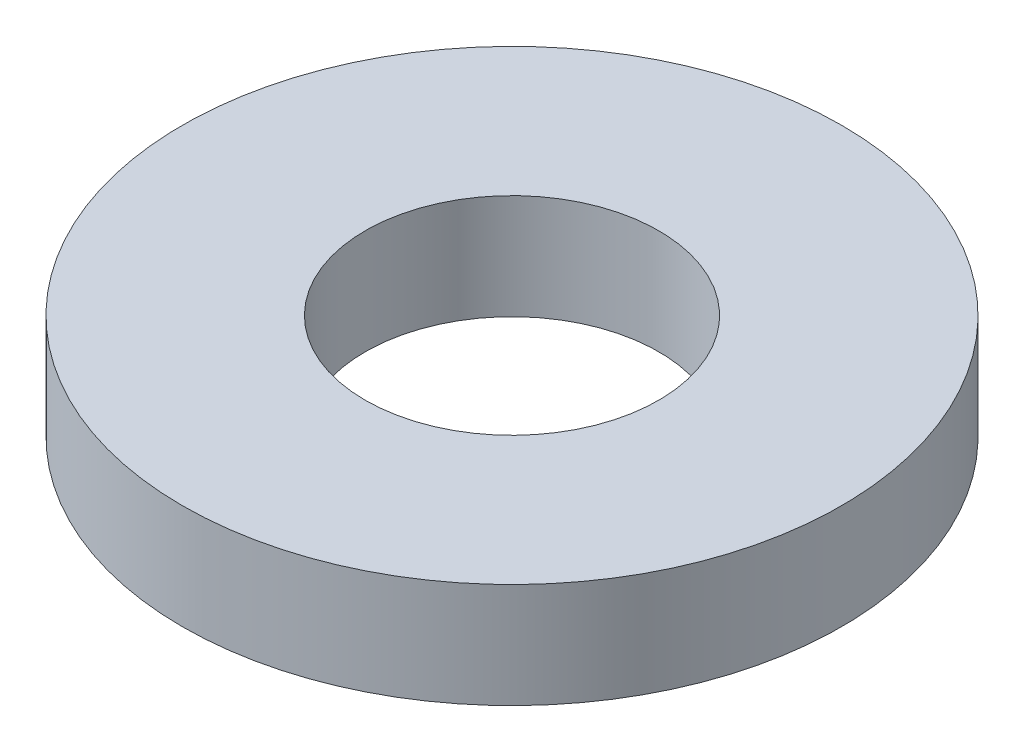
ISO-10303-21;
HEADER;
FILE_DESCRIPTION(('STEP AP214'),'2;1');
FILE_NAME('part.step','',(''),(''),'','','');
FILE_SCHEMA(('AUTOMOTIVE_DESIGN { 1 0 10303 214 1 1 1 1 }'));
ENDSEC;
DATA;
#1=APPLICATION_CONTEXT('core data for automotive mechanical design processes');
#2=APPLICATION_PROTOCOL_DEFINITION('international standard','automotive_design',2000,#1);
#3=PRODUCT_CONTEXT('',#1,'mechanical');
#4=PRODUCT('Part','Part','',(#3));
#5=PRODUCT_RELATED_PRODUCT_CATEGORY('part','',(#4));
#6=PRODUCT_DEFINITION_FORMATION('','',#4);
#7=PRODUCT_DEFINITION_CONTEXT('part definition',#1,'design');
#8=PRODUCT_DEFINITION('design','',#6,#7);
#9=PRODUCT_DEFINITION_SHAPE('','',#8);
#10=(LENGTH_UNIT() NAMED_UNIT(*) SI_UNIT(.MILLI.,.METRE.));
#11=(NAMED_UNIT(*) PLANE_ANGLE_UNIT() SI_UNIT($,.RADIAN.));
#12=(NAMED_UNIT(*) SI_UNIT($,.STERADIAN.) SOLID_ANGLE_UNIT());
#13=UNCERTAINTY_MEASURE_WITH_UNIT(LENGTH_MEASURE(1.E-05),#10,'distance_accuracy_value','');
#14=(GEOMETRIC_REPRESENTATION_CONTEXT(3) GLOBAL_UNCERTAINTY_ASSIGNED_CONTEXT((#13)) GLOBAL_UNIT_ASSIGNED_CONTEXT((#10,
#11,#12)) REPRESENTATION_CONTEXT('',''));
#15=CARTESIAN_POINT('',(0.,0.,0.));
#16=DIRECTION('',(0.,0.,1.));
#17=DIRECTION('',(1.,0.,0.));
#18=AXIS2_PLACEMENT_3D('',#15,#16,#17);
#19=CARTESIAN_POINT('',(0.,1.778,0.));
#20=DIRECTION('',(0.,1.,0.));
#21=DIRECTION('',(0.,0.,1.));
#22=AXIS2_PLACEMENT_3D('',#19,#20,#21);
#23=PLANE('',#22);
#24=CARTESIAN_POINT('',(0.,1.778,0.));
#25=DIRECTION('',(0.,1.,0.));
#26=DIRECTION('',(0.,0.,1.));
#27=AXIS2_PLACEMENT_3D('',#24,#25,#26);
#28=CIRCLE('',#27,5.588);
#29=CARTESIAN_POINT('',(0.,1.778,5.588));
#30=VERTEX_POINT('',#29);
#31=EDGE_CURVE('E10',#30,#30,#28,.T.);
#32=ORIENTED_EDGE('',*,*,#31,.T.);
#33=EDGE_LOOP('',(#32));
#34=FACE_BOUND('',#33,.T.);
#35=CARTESIAN_POINT('',(0.,1.778,0.));
#36=DIRECTION('',(0.,1.,0.));
#37=DIRECTION('',(0.,0.,1.));
#38=AXIS2_PLACEMENT_3D('',#35,#36,#37);
#39=CIRCLE('',#38,2.4892);
#40=CARTESIAN_POINT('',(0.,1.778,2.4892));
#41=VERTEX_POINT('',#40);
#42=EDGE_CURVE('E50',#41,#41,#39,.T.);
#43=ORIENTED_EDGE('',*,*,#42,.F.);
#44=EDGE_LOOP('',(#43));
#45=FACE_BOUND('',#44,.T.);
#46=ADVANCED_FACE('F37',(#34,#45),#23,.T.);
#47=CARTESIAN_POINT('',(0.,0.,0.));
#48=DIRECTION('',(0.,1.,0.));
#49=DIRECTION('',(0.,0.,1.));
#50=AXIS2_PLACEMENT_3D('',#47,#48,#49);
#51=PLANE('',#50);
#52=CARTESIAN_POINT('',(0.,0.,0.));
#53=DIRECTION('',(0.,1.,0.));
#54=DIRECTION('',(0.,0.,1.));
#55=AXIS2_PLACEMENT_3D('',#52,#53,#54);
#56=CIRCLE('',#55,5.588);
#57=CARTESIAN_POINT('',(0.,0.,5.588));
#58=VERTEX_POINT('',#57);
#59=EDGE_CURVE('E41',#58,#58,#56,.T.);
#60=ORIENTED_EDGE('',*,*,#59,.F.);
#61=EDGE_LOOP('',(#60));
#62=FACE_BOUND('',#61,.T.);
#63=CARTESIAN_POINT('',(0.,0.,0.));
#64=DIRECTION('',(0.,1.,0.));
#65=DIRECTION('',(0.,0.,1.));
#66=AXIS2_PLACEMENT_3D('',#63,#64,#65);
#67=CIRCLE('',#66,2.4892);
#68=CARTESIAN_POINT('',(0.,0.,2.4892));
#69=VERTEX_POINT('',#68);
#70=EDGE_CURVE('E52',#69,#69,#67,.T.);
#71=ORIENTED_EDGE('',*,*,#70,.T.);
#72=EDGE_LOOP('',(#71));
#73=FACE_BOUND('',#72,.T.);
#74=ADVANCED_FACE('F64',(#62,#73),#51,.F.);
#75=CARTESIAN_POINT('',(0.,1.778,0.));
#76=DIRECTION('',(0.,-1.,0.));
#77=DIRECTION('',(0.,0.,-1.));
#78=AXIS2_PLACEMENT_3D('',#75,#76,#77);
#79=CYLINDRICAL_SURFACE('',#78,5.588);
#80=ORIENTED_EDGE('',*,*,#31,.F.);
#81=EDGE_LOOP('',(#80));
#82=FACE_BOUND('',#81,.T.);
#83=ORIENTED_EDGE('',*,*,#59,.T.);
#84=EDGE_LOOP('',(#83));
#85=FACE_BOUND('',#84,.T.);
#86=ADVANCED_FACE('F39',(#82,#85),#79,.T.);
#87=CARTESIAN_POINT('',(0.,1.778,0.));
#88=DIRECTION('',(0.,-1.,0.));
#89=DIRECTION('',(0.,0.,-1.));
#90=AXIS2_PLACEMENT_3D('',#87,#88,#89);
#91=CYLINDRICAL_SURFACE('',#90,2.4892);
#92=ORIENTED_EDGE('',*,*,#42,.T.);
#93=EDGE_LOOP('',(#92));
#94=FACE_BOUND('',#93,.T.);
#95=ORIENTED_EDGE('',*,*,#70,.F.);
#96=EDGE_LOOP('',(#95));
#97=FACE_BOUND('',#96,.T.);
#98=ADVANCED_FACE('F60',(#94,#97),#91,.F.);
#99=CLOSED_SHELL('',(#46,#74,#86,#98));
#100=MANIFOLD_SOLID_BREP('B2',#99);
#101=ADVANCED_BREP_SHAPE_REPRESENTATION('',(#18,#100),#14);
#102=SHAPE_DEFINITION_REPRESENTATION(#9,#101);
ENDSEC;
END-ISO-10303-21;
